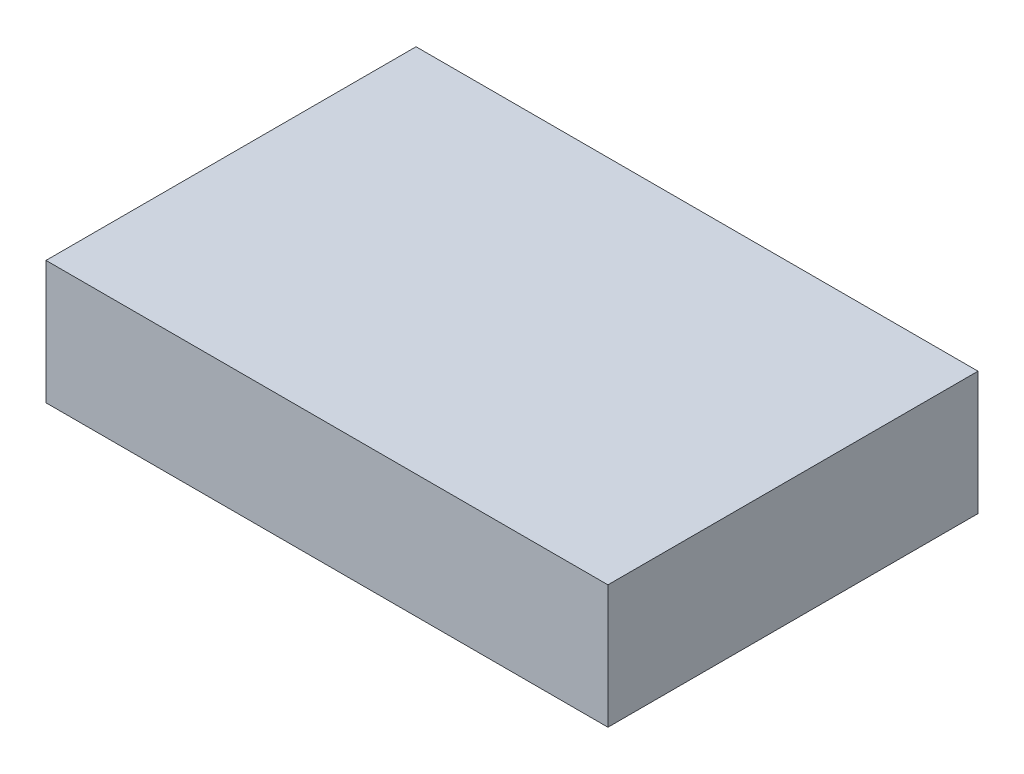
ISO-10303-21;
HEADER;
FILE_DESCRIPTION(('STEP AP214'),'2;1');
FILE_NAME('part.step','',(''),(''),'','','');
FILE_SCHEMA(('AUTOMOTIVE_DESIGN { 1 0 10303 214 1 1 1 1 }'));
ENDSEC;
DATA;
#1=APPLICATION_CONTEXT('core data for automotive mechanical design processes');
#2=APPLICATION_PROTOCOL_DEFINITION('international standard','automotive_design',2000,#1);
#3=PRODUCT_CONTEXT('',#1,'mechanical');
#4=PRODUCT('Part','Part','',(#3));
#5=PRODUCT_RELATED_PRODUCT_CATEGORY('part','',(#4));
#6=PRODUCT_DEFINITION_FORMATION('','',#4);
#7=PRODUCT_DEFINITION_CONTEXT('part definition',#1,'design');
#8=PRODUCT_DEFINITION('design','',#6,#7);
#9=PRODUCT_DEFINITION_SHAPE('','',#8);
#10=(LENGTH_UNIT() NAMED_UNIT(*) SI_UNIT(.MILLI.,.METRE.));
#11=(NAMED_UNIT(*) PLANE_ANGLE_UNIT() SI_UNIT($,.RADIAN.));
#12=(NAMED_UNIT(*) SI_UNIT($,.STERADIAN.) SOLID_ANGLE_UNIT());
#13=UNCERTAINTY_MEASURE_WITH_UNIT(LENGTH_MEASURE(1.E-05),#10,'distance_accuracy_value','');
#14=(GEOMETRIC_REPRESENTATION_CONTEXT(3) GLOBAL_UNCERTAINTY_ASSIGNED_CONTEXT((#13)) GLOBAL_UNIT_ASSIGNED_CONTEXT((#10,
#11,#12)) REPRESENTATION_CONTEXT('',''));
#15=CARTESIAN_POINT('',(0.,0.,0.));
#16=DIRECTION('',(0.,0.,1.));
#17=DIRECTION('',(1.,0.,0.));
#18=AXIS2_PLACEMENT_3D('',#15,#16,#17);
#19=CARTESIAN_POINT('',(41.,18.,27.));
#20=DIRECTION('',(-1.,0.,0.));
#21=DIRECTION('',(0.,0.,1.));
#22=AXIS2_PLACEMENT_3D('',#19,#20,#21);
#23=PLANE('',#22);
#24=DIRECTION('',(0.,0.,-1.));
#25=VECTOR('',#24,1.);
#26=CARTESIAN_POINT('',(41.,0.,27.));
#27=LINE('',#26,#25);
#28=CARTESIAN_POINT('',(41.,0.,27.));
#29=VERTEX_POINT('',#28);
#30=CARTESIAN_POINT('',(41.,0.,-27.));
#31=VERTEX_POINT('',#30);
#32=EDGE_CURVE('E96',#29,#31,#27,.T.);
#33=ORIENTED_EDGE('',*,*,#32,.T.);
#34=DIRECTION('',(0.,-1.,0.));
#35=VECTOR('',#34,1.);
#36=CARTESIAN_POINT('',(41.,18.,-27.));
#37=LINE('',#36,#35);
#38=CARTESIAN_POINT('',(41.,18.,-27.));
#39=VERTEX_POINT('',#38);
#40=EDGE_CURVE('E11',#39,#31,#37,.T.);
#41=ORIENTED_EDGE('',*,*,#40,.F.);
#42=DIRECTION('',(0.,0.,-1.));
#43=VECTOR('',#42,1.);
#44=CARTESIAN_POINT('',(41.,18.,27.));
#45=LINE('',#44,#43);
#46=CARTESIAN_POINT('',(41.,18.,27.));
#47=VERTEX_POINT('',#46);
#48=EDGE_CURVE('E84',#47,#39,#45,.T.);
#49=ORIENTED_EDGE('',*,*,#48,.F.);
#50=DIRECTION('',(0.,-1.,0.));
#51=VECTOR('',#50,1.);
#52=CARTESIAN_POINT('',(41.,18.,27.));
#53=LINE('',#52,#51);
#54=EDGE_CURVE('E92',#47,#29,#53,.T.);
#55=ORIENTED_EDGE('',*,*,#54,.T.);
#56=EDGE_LOOP('',(#33,#41,#49,#55));
#57=FACE_BOUND('',#56,.T.);
#58=ADVANCED_FACE('F33',(#57),#23,.F.);
#59=CARTESIAN_POINT('',(-41.,18.,-27.));
#60=DIRECTION('',(0.,0.,1.));
#61=DIRECTION('',(1.,0.,0.));
#62=AXIS2_PLACEMENT_3D('',#59,#60,#61);
#63=PLANE('',#62);
#64=DIRECTION('',(-1.,0.,0.));
#65=VECTOR('',#64,1.);
#66=CARTESIAN_POINT('',(-41.,0.,-27.));
#67=LINE('',#66,#65);
#68=CARTESIAN_POINT('',(-41.,0.,-27.));
#69=VERTEX_POINT('',#68);
#70=EDGE_CURVE('E88',#31,#69,#67,.T.);
#71=ORIENTED_EDGE('',*,*,#70,.T.);
#72=DIRECTION('',(0.,-1.,0.));
#73=VECTOR('',#72,1.);
#74=CARTESIAN_POINT('',(-41.,18.,-27.));
#75=LINE('',#74,#73);
#76=CARTESIAN_POINT('',(-41.,18.,-27.));
#77=VERTEX_POINT('',#76);
#78=EDGE_CURVE('E41',#77,#69,#75,.T.);
#79=ORIENTED_EDGE('',*,*,#78,.F.);
#80=DIRECTION('',(-1.,0.,0.));
#81=VECTOR('',#80,1.);
#82=CARTESIAN_POINT('',(-41.,18.,-27.));
#83=LINE('',#82,#81);
#84=EDGE_CURVE('E79',#39,#77,#83,.T.);
#85=ORIENTED_EDGE('',*,*,#84,.F.);
#86=ORIENTED_EDGE('',*,*,#40,.T.);
#87=EDGE_LOOP('',(#71,#79,#85,#86));
#88=FACE_BOUND('',#87,.T.);
#89=ADVANCED_FACE('F87',(#88),#63,.F.);
#90=CARTESIAN_POINT('',(-41.,18.,27.));
#91=DIRECTION('',(1.,0.,0.));
#92=DIRECTION('',(0.,0.,-1.));
#93=AXIS2_PLACEMENT_3D('',#90,#91,#92);
#94=PLANE('',#93);
#95=DIRECTION('',(0.,0.,1.));
#96=VECTOR('',#95,1.);
#97=CARTESIAN_POINT('',(-41.,0.,27.));
#98=LINE('',#97,#96);
#99=CARTESIAN_POINT('',(-41.,0.,27.));
#100=VERTEX_POINT('',#99);
#101=EDGE_CURVE('E66',#69,#100,#98,.T.);
#102=ORIENTED_EDGE('',*,*,#101,.T.);
#103=DIRECTION('',(0.,-1.,0.));
#104=VECTOR('',#103,1.);
#105=CARTESIAN_POINT('',(-41.,18.,27.));
#106=LINE('',#105,#104);
#107=CARTESIAN_POINT('',(-41.,18.,27.));
#108=VERTEX_POINT('',#107);
#109=EDGE_CURVE('E89',#108,#100,#106,.T.);
#110=ORIENTED_EDGE('',*,*,#109,.F.);
#111=DIRECTION('',(0.,0.,1.));
#112=VECTOR('',#111,1.);
#113=CARTESIAN_POINT('',(-41.,18.,27.));
#114=LINE('',#113,#112);
#115=EDGE_CURVE('E82',#77,#108,#114,.T.);
#116=ORIENTED_EDGE('',*,*,#115,.F.);
#117=ORIENTED_EDGE('',*,*,#78,.T.);
#118=EDGE_LOOP('',(#102,#110,#116,#117));
#119=FACE_BOUND('',#118,.T.);
#120=ADVANCED_FACE('F90',(#119),#94,.F.);
#121=CARTESIAN_POINT('',(-41.,18.,27.));
#122=DIRECTION('',(0.,0.,-1.));
#123=DIRECTION('',(-1.,0.,0.));
#124=AXIS2_PLACEMENT_3D('',#121,#122,#123);
#125=PLANE('',#124);
#126=DIRECTION('',(1.,0.,0.));
#127=VECTOR('',#126,1.);
#128=CARTESIAN_POINT('',(-41.,0.,27.));
#129=LINE('',#128,#127);
#130=EDGE_CURVE('E72',#100,#29,#129,.T.);
#131=ORIENTED_EDGE('',*,*,#130,.T.);
#132=ORIENTED_EDGE('',*,*,#54,.F.);
#133=DIRECTION('',(1.,0.,0.));
#134=VECTOR('',#133,1.);
#135=CARTESIAN_POINT('',(-41.,18.,27.));
#136=LINE('',#135,#134);
#137=EDGE_CURVE('E49',#108,#47,#136,.T.);
#138=ORIENTED_EDGE('',*,*,#137,.F.);
#139=ORIENTED_EDGE('',*,*,#109,.T.);
#140=EDGE_LOOP('',(#131,#132,#138,#139));
#141=FACE_BOUND('',#140,.T.);
#142=ADVANCED_FACE('F103',(#141),#125,.F.);
#143=CARTESIAN_POINT('',(0.,18.,0.));
#144=DIRECTION('',(0.,-1.,0.));
#145=DIRECTION('',(0.,0.,-1.));
#146=AXIS2_PLACEMENT_3D('',#143,#144,#145);
#147=PLANE('',#146);
#148=ORIENTED_EDGE('',*,*,#48,.T.);
#149=ORIENTED_EDGE('',*,*,#84,.T.);
#150=ORIENTED_EDGE('',*,*,#115,.T.);
#151=ORIENTED_EDGE('',*,*,#137,.T.);
#152=EDGE_LOOP('',(#148,#149,#150,#151));
#153=FACE_BOUND('',#152,.T.);
#154=ADVANCED_FACE('F80',(#153),#147,.F.);
#155=CARTESIAN_POINT('',(0.,0.,0.));
#156=DIRECTION('',(0.,-1.,0.));
#157=DIRECTION('',(0.,0.,-1.));
#158=AXIS2_PLACEMENT_3D('',#155,#156,#157);
#159=PLANE('',#158);
#160=ORIENTED_EDGE('',*,*,#32,.F.);
#161=ORIENTED_EDGE('',*,*,#130,.F.);
#162=ORIENTED_EDGE('',*,*,#101,.F.);
#163=ORIENTED_EDGE('',*,*,#70,.F.);
#164=EDGE_LOOP('',(#160,#161,#162,#163));
#165=FACE_BOUND('',#164,.T.);
#166=ADVANCED_FACE('F106',(#165),#159,.T.);
#167=CLOSED_SHELL('',(#58,#89,#120,#142,#154,#166));
#168=MANIFOLD_SOLID_BREP('B2',#167);
#169=ADVANCED_BREP_SHAPE_REPRESENTATION('',(#18,#168),#14);
#170=SHAPE_DEFINITION_REPRESENTATION(#9,#169);
ENDSEC;
END-ISO-10303-21;
